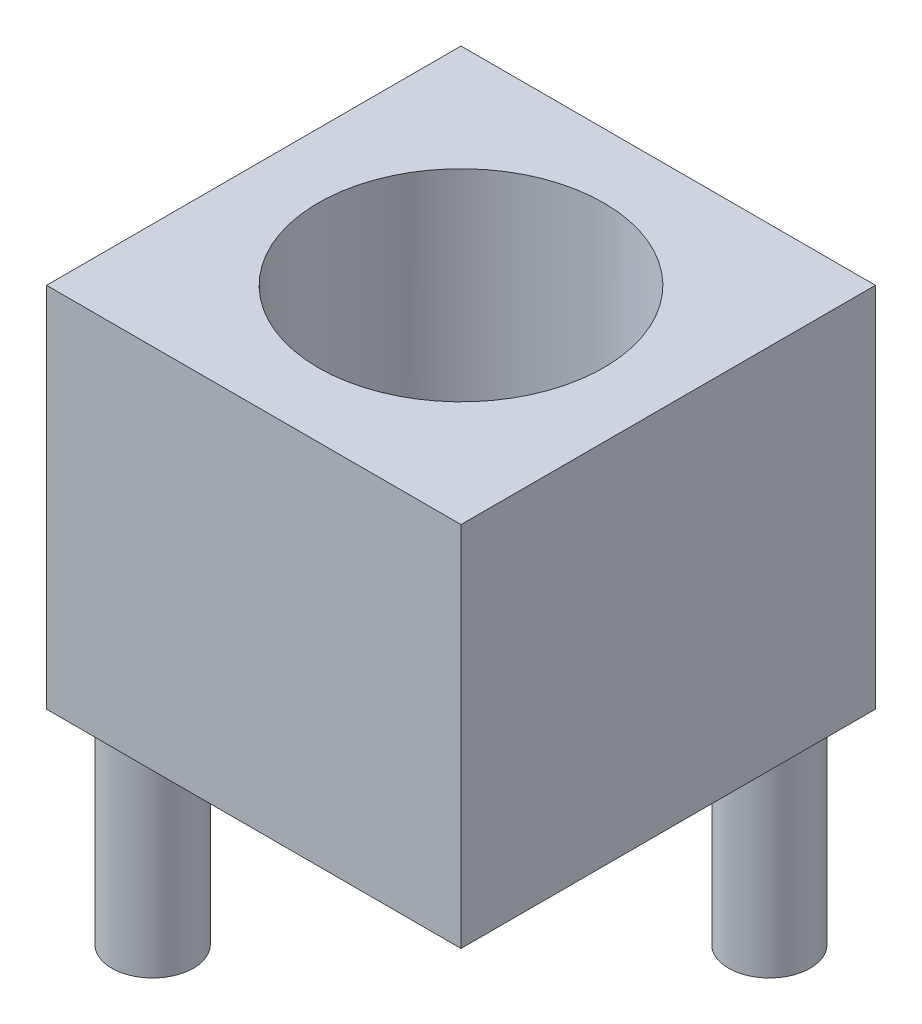
ISO-10303-21;
HEADER;
FILE_DESCRIPTION(('STEP AP214'),'2;1');
FILE_NAME('part.step','',(''),(''),'','','');
FILE_SCHEMA(('AUTOMOTIVE_DESIGN { 1 0 10303 214 1 1 1 1 }'));
ENDSEC;
DATA;
#1=APPLICATION_CONTEXT('core data for automotive mechanical design processes');
#2=APPLICATION_PROTOCOL_DEFINITION('international standard','automotive_design',2000,#1);
#3=PRODUCT_CONTEXT('',#1,'mechanical');
#4=PRODUCT('Part','Part','',(#3));
#5=PRODUCT_RELATED_PRODUCT_CATEGORY('part','',(#4));
#6=PRODUCT_DEFINITION_FORMATION('','',#4);
#7=PRODUCT_DEFINITION_CONTEXT('part definition',#1,'design');
#8=PRODUCT_DEFINITION('design','',#6,#7);
#9=PRODUCT_DEFINITION_SHAPE('','',#8);
#10=(LENGTH_UNIT() NAMED_UNIT(*) SI_UNIT(.MILLI.,.METRE.));
#11=(NAMED_UNIT(*) PLANE_ANGLE_UNIT() SI_UNIT($,.RADIAN.));
#12=(NAMED_UNIT(*) SI_UNIT($,.STERADIAN.) SOLID_ANGLE_UNIT());
#13=UNCERTAINTY_MEASURE_WITH_UNIT(LENGTH_MEASURE(1.E-05),#10,'distance_accuracy_value','');
#14=(GEOMETRIC_REPRESENTATION_CONTEXT(3) GLOBAL_UNCERTAINTY_ASSIGNED_CONTEXT((#13)) GLOBAL_UNIT_ASSIGNED_CONTEXT((#10,
#11,#12)) REPRESENTATION_CONTEXT('',''));
#15=CARTESIAN_POINT('',(0.,0.,0.));
#16=DIRECTION('',(0.,0.,1.));
#17=DIRECTION('',(1.,0.,0.));
#18=AXIS2_PLACEMENT_3D('',#15,#16,#17);
#19=CARTESIAN_POINT('',(0.,2.,0.));
#20=DIRECTION('',(0.,1.,0.));
#21=DIRECTION('',(0.,0.,1.));
#22=AXIS2_PLACEMENT_3D('',#19,#20,#21);
#23=PLANE('',#22);
#24=DIRECTION('',(1.,0.,0.));
#25=VECTOR('',#24,1.);
#26=CARTESIAN_POINT('',(0.,2.,-1.25));
#27=LINE('',#26,#25);
#28=CARTESIAN_POINT('',(-1.22474487139159,2.,-1.25));
#29=VERTEX_POINT('',#28);
#30=CARTESIAN_POINT('',(1.22474487139159,2.,-1.25));
#31=VERTEX_POINT('',#30);
#32=EDGE_CURVE('E157',#29,#31,#27,.T.);
#33=ORIENTED_EDGE('',*,*,#32,.T.);
#34=CARTESIAN_POINT('',(0.,2.,0.));
#35=DIRECTION('',(0.,1.,0.));
#36=DIRECTION('',(0.,0.,1.));
#37=AXIS2_PLACEMENT_3D('',#34,#35,#36);
#38=CIRCLE('',#37,1.75);
#39=EDGE_CURVE('E41',#31,#29,#38,.T.);
#40=ORIENTED_EDGE('',*,*,#39,.T.);
#41=EDGE_LOOP('',(#33,#40));
#42=FACE_BOUND('',#41,.T.);
#43=ADVANCED_FACE('F33',(#42),#23,.T.);
#44=DIRECTION('',(1.,0.,0.));
#45=VECTOR('',#44,1.);
#46=CARTESIAN_POINT('',(0.,2.,1.25));
#47=LINE('',#46,#45);
#48=CARTESIAN_POINT('',(-1.22474487139159,2.,1.25));
#49=VERTEX_POINT('',#48);
#50=CARTESIAN_POINT('',(1.22474487139159,2.,1.25));
#51=VERTEX_POINT('',#50);
#52=EDGE_CURVE('E162',#49,#51,#47,.T.);
#53=ORIENTED_EDGE('',*,*,#52,.F.);
#54=EDGE_CURVE('E149',#49,#51,#38,.T.);
#55=ORIENTED_EDGE('',*,*,#54,.T.);
#56=EDGE_LOOP('',(#53,#55));
#57=FACE_BOUND('',#56,.T.);
#58=ADVANCED_FACE('F208',(#57),#23,.T.);
#59=CARTESIAN_POINT('',(-2.,2.,0.));
#60=DIRECTION('',(1.,0.,0.));
#61=DIRECTION('',(0.,0.,-1.));
#62=AXIS2_PLACEMENT_3D('',#59,#60,#61);
#63=PLANE('',#62);
#64=DIRECTION('',(0.,0.,1.));
#65=VECTOR('',#64,1.);
#66=CARTESIAN_POINT('',(-2.,0.,0.));
#67=LINE('',#66,#65);
#68=CARTESIAN_POINT('',(-2.,0.,-1.25));
#69=VERTEX_POINT('',#68);
#70=CARTESIAN_POINT('',(-2.,0.,1.25));
#71=VERTEX_POINT('',#70);
#72=EDGE_CURVE('E170',#69,#71,#67,.T.);
#73=ORIENTED_EDGE('',*,*,#72,.F.);
#74=DIRECTION('',(0.,-1.,0.));
#75=VECTOR('',#74,1.);
#76=CARTESIAN_POINT('',(-2.,2.,-1.25));
#77=LINE('',#76,#75);
#78=CARTESIAN_POINT('',(-2.,2.,-1.25));
#79=VERTEX_POINT('',#78);
#80=EDGE_CURVE('E186',#79,#69,#77,.T.);
#81=ORIENTED_EDGE('',*,*,#80,.F.);
#82=DIRECTION('',(0.,0.,1.));
#83=VECTOR('',#82,1.);
#84=CARTESIAN_POINT('',(-2.,2.,0.));
#85=LINE('',#84,#83);
#86=CARTESIAN_POINT('',(-2.,2.,1.25));
#87=VERTEX_POINT('',#86);
#88=EDGE_CURVE('E150',#79,#87,#85,.T.);
#89=ORIENTED_EDGE('',*,*,#88,.T.);
#90=DIRECTION('',(0.,-1.,0.));
#91=VECTOR('',#90,1.);
#92=CARTESIAN_POINT('',(-2.,2.,1.25));
#93=LINE('',#92,#91);
#94=EDGE_CURVE('E56',#87,#71,#93,.T.);
#95=ORIENTED_EDGE('',*,*,#94,.T.);
#96=EDGE_LOOP('',(#73,#81,#89,#95));
#97=FACE_BOUND('',#96,.T.);
#98=ADVANCED_FACE('F214',(#97),#63,.T.);
#99=CARTESIAN_POINT('',(0.,2.,-1.25));
#100=DIRECTION('',(0.,0.,-1.));
#101=DIRECTION('',(-1.,0.,0.));
#102=AXIS2_PLACEMENT_3D('',#99,#100,#101);
#103=PLANE('',#102);
#104=DIRECTION('',(1.,0.,0.));
#105=VECTOR('',#104,1.);
#106=CARTESIAN_POINT('',(0.,0.,-1.25));
#107=LINE('',#106,#105);
#108=CARTESIAN_POINT('',(2.,0.,-1.25));
#109=VERTEX_POINT('',#108);
#110=EDGE_CURVE('E172',#69,#109,#107,.T.);
#111=ORIENTED_EDGE('',*,*,#110,.T.);
#112=DIRECTION('',(0.,-1.,0.));
#113=VECTOR('',#112,1.);
#114=CARTESIAN_POINT('',(2.,2.,-1.25));
#115=LINE('',#114,#113);
#116=CARTESIAN_POINT('',(2.,2.,-1.25));
#117=VERTEX_POINT('',#116);
#118=EDGE_CURVE('E183',#117,#109,#115,.T.);
#119=ORIENTED_EDGE('',*,*,#118,.F.);
#120=EDGE_CURVE('E152',#31,#117,#27,.T.);
#121=ORIENTED_EDGE('',*,*,#120,.F.);
#122=ORIENTED_EDGE('',*,*,#32,.F.);
#123=EDGE_CURVE('E154',#79,#29,#27,.T.);
#124=ORIENTED_EDGE('',*,*,#123,.F.);
#125=ORIENTED_EDGE('',*,*,#80,.T.);
#126=EDGE_LOOP('',(#111,#119,#121,#122,#124,#125));
#127=FACE_BOUND('',#126,.T.);
#128=ADVANCED_FACE('F231',(#127),#103,.F.);
#129=CARTESIAN_POINT('',(2.,2.,0.));
#130=DIRECTION('',(1.,0.,0.));
#131=DIRECTION('',(0.,0.,-1.));
#132=AXIS2_PLACEMENT_3D('',#129,#130,#131);
#133=PLANE('',#132);
#134=DIRECTION('',(0.,0.,1.));
#135=VECTOR('',#134,1.);
#136=CARTESIAN_POINT('',(2.,0.,0.));
#137=LINE('',#136,#135);
#138=CARTESIAN_POINT('',(2.,0.,1.25));
#139=VERTEX_POINT('',#138);
#140=EDGE_CURVE('E175',#109,#139,#137,.T.);
#141=ORIENTED_EDGE('',*,*,#140,.T.);
#142=DIRECTION('',(0.,-1.,0.));
#143=VECTOR('',#142,1.);
#144=CARTESIAN_POINT('',(2.,2.,1.25));
#145=LINE('',#144,#143);
#146=CARTESIAN_POINT('',(2.,2.,1.25));
#147=VERTEX_POINT('',#146);
#148=EDGE_CURVE('E181',#147,#139,#145,.T.);
#149=ORIENTED_EDGE('',*,*,#148,.F.);
#150=DIRECTION('',(0.,0.,1.));
#151=VECTOR('',#150,1.);
#152=CARTESIAN_POINT('',(2.,2.,0.));
#153=LINE('',#152,#151);
#154=EDGE_CURVE('E156',#117,#147,#153,.T.);
#155=ORIENTED_EDGE('',*,*,#154,.F.);
#156=ORIENTED_EDGE('',*,*,#118,.T.);
#157=EDGE_LOOP('',(#141,#149,#155,#156));
#158=FACE_BOUND('',#157,.T.);
#159=ADVANCED_FACE('F228',(#158),#133,.F.);
#160=CARTESIAN_POINT('',(2.54,2.,0.));
#161=DIRECTION('',(1.,0.,0.));
#162=DIRECTION('',(0.,0.,-1.));
#163=AXIS2_PLACEMENT_3D('',#160,#161,#162);
#164=PLANE('',#163);
#165=DIRECTION('',(0.,0.,1.));
#166=VECTOR('',#165,1.);
#167=CARTESIAN_POINT('',(2.54,0.,0.));
#168=LINE('',#167,#166);
#169=CARTESIAN_POINT('',(2.54,0.,-2.54));
#170=VERTEX_POINT('',#169);
#171=CARTESIAN_POINT('',(2.54,0.,2.54));
#172=VERTEX_POINT('',#171);
#173=EDGE_CURVE('E146',#170,#172,#168,.T.);
#174=ORIENTED_EDGE('',*,*,#173,.F.);
#175=DIRECTION('',(0.,-1.,0.));
#176=VECTOR('',#175,1.);
#177=CARTESIAN_POINT('',(2.54,2.,-2.54));
#178=LINE('',#177,#176);
#179=CARTESIAN_POINT('',(2.54,4.5,-2.54));
#180=VERTEX_POINT('',#179);
#181=EDGE_CURVE('E128',#180,#170,#178,.T.);
#182=ORIENTED_EDGE('',*,*,#181,.F.);
#183=DIRECTION('',(0.,0.,-1.));
#184=VECTOR('',#183,1.);
#185=CARTESIAN_POINT('',(2.54,4.5,0.));
#186=LINE('',#185,#184);
#187=CARTESIAN_POINT('',(2.54,4.5,2.54));
#188=VERTEX_POINT('',#187);
#189=EDGE_CURVE('E127',#188,#180,#186,.T.);
#190=ORIENTED_EDGE('',*,*,#189,.F.);
#191=DIRECTION('',(0.,-1.,0.));
#192=VECTOR('',#191,1.);
#193=CARTESIAN_POINT('',(2.54,2.,2.54));
#194=LINE('',#193,#192);
#195=EDGE_CURVE('E112',#188,#172,#194,.T.);
#196=ORIENTED_EDGE('',*,*,#195,.T.);
#197=EDGE_LOOP('',(#174,#182,#190,#196));
#198=FACE_BOUND('',#197,.T.);
#199=ADVANCED_FACE('F35',(#198),#164,.T.);
#200=CARTESIAN_POINT('',(0.,2.,-2.54));
#201=DIRECTION('',(0.,0.,-1.));
#202=DIRECTION('',(-1.,0.,0.));
#203=AXIS2_PLACEMENT_3D('',#200,#201,#202);
#204=PLANE('',#203);
#205=DIRECTION('',(1.,0.,0.));
#206=VECTOR('',#205,1.);
#207=CARTESIAN_POINT('',(0.,0.,-2.54));
#208=LINE('',#207,#206);
#209=CARTESIAN_POINT('',(-2.54,0.,-2.54));
#210=VERTEX_POINT('',#209);
#211=EDGE_CURVE('E164',#210,#170,#208,.T.);
#212=ORIENTED_EDGE('',*,*,#211,.F.);
#213=DIRECTION('',(0.,-1.,0.));
#214=VECTOR('',#213,1.);
#215=CARTESIAN_POINT('',(-2.54,2.,-2.54));
#216=LINE('',#215,#214);
#217=CARTESIAN_POINT('',(-2.54,4.5,-2.54));
#218=VERTEX_POINT('',#217);
#219=EDGE_CURVE('E189',#218,#210,#216,.T.);
#220=ORIENTED_EDGE('',*,*,#219,.F.);
#221=DIRECTION('',(-1.,0.,0.));
#222=VECTOR('',#221,1.);
#223=CARTESIAN_POINT('',(0.,4.5,-2.54));
#224=LINE('',#223,#222);
#225=EDGE_CURVE('E132',#180,#218,#224,.T.);
#226=ORIENTED_EDGE('',*,*,#225,.F.);
#227=ORIENTED_EDGE('',*,*,#181,.T.);
#228=EDGE_LOOP('',(#212,#220,#226,#227));
#229=FACE_BOUND('',#228,.T.);
#230=ADVANCED_FACE('F192',(#229),#204,.T.);
#231=CARTESIAN_POINT('',(-2.54,2.,0.));
#232=DIRECTION('',(1.,0.,0.));
#233=DIRECTION('',(0.,0.,-1.));
#234=AXIS2_PLACEMENT_3D('',#231,#232,#233);
#235=PLANE('',#234);
#236=DIRECTION('',(0.,0.,1.));
#237=VECTOR('',#236,1.);
#238=CARTESIAN_POINT('',(-2.54,0.,0.));
#239=LINE('',#238,#237);
#240=CARTESIAN_POINT('',(-2.54,0.,2.54));
#241=VERTEX_POINT('',#240);
#242=EDGE_CURVE('E167',#210,#241,#239,.T.);
#243=ORIENTED_EDGE('',*,*,#242,.T.);
#244=DIRECTION('',(0.,-1.,0.));
#245=VECTOR('',#244,1.);
#246=CARTESIAN_POINT('',(-2.54,2.,2.54));
#247=LINE('',#246,#245);
#248=CARTESIAN_POINT('',(-2.54,4.5,2.54));
#249=VERTEX_POINT('',#248);
#250=EDGE_CURVE('E123',#249,#241,#247,.T.);
#251=ORIENTED_EDGE('',*,*,#250,.F.);
#252=DIRECTION('',(0.,0.,1.));
#253=VECTOR('',#252,1.);
#254=CARTESIAN_POINT('',(-2.54,4.5,0.));
#255=LINE('',#254,#253);
#256=EDGE_CURVE('E137',#218,#249,#255,.T.);
#257=ORIENTED_EDGE('',*,*,#256,.F.);
#258=ORIENTED_EDGE('',*,*,#219,.T.);
#259=EDGE_LOOP('',(#243,#251,#257,#258));
#260=FACE_BOUND('',#259,.T.);
#261=ADVANCED_FACE('F198',(#260),#235,.F.);
#262=CARTESIAN_POINT('',(0.,2.,2.54));
#263=DIRECTION('',(0.,0.,-1.));
#264=DIRECTION('',(-1.,0.,0.));
#265=AXIS2_PLACEMENT_3D('',#262,#263,#264);
#266=PLANE('',#265);
#267=DIRECTION('',(1.,0.,0.));
#268=VECTOR('',#267,1.);
#269=CARTESIAN_POINT('',(0.,0.,2.54));
#270=LINE('',#269,#268);
#271=EDGE_CURVE('E119',#241,#172,#270,.T.);
#272=ORIENTED_EDGE('',*,*,#271,.T.);
#273=ORIENTED_EDGE('',*,*,#195,.F.);
#274=DIRECTION('',(1.,0.,0.));
#275=VECTOR('',#274,1.);
#276=CARTESIAN_POINT('',(0.,4.5,2.54));
#277=LINE('',#276,#275);
#278=EDGE_CURVE('E117',#249,#188,#277,.T.);
#279=ORIENTED_EDGE('',*,*,#278,.F.);
#280=ORIENTED_EDGE('',*,*,#250,.T.);
#281=EDGE_LOOP('',(#272,#273,#279,#280));
#282=FACE_BOUND('',#281,.T.);
#283=ADVANCED_FACE('F114',(#282),#266,.F.);
#284=CARTESIAN_POINT('',(0.,2.,1.25));
#285=DIRECTION('',(0.,0.,-1.));
#286=DIRECTION('',(-1.,0.,0.));
#287=AXIS2_PLACEMENT_3D('',#284,#285,#286);
#288=PLANE('',#287);
#289=DIRECTION('',(1.,0.,0.));
#290=VECTOR('',#289,1.);
#291=CARTESIAN_POINT('',(0.,0.,1.25));
#292=LINE('',#291,#290);
#293=EDGE_CURVE('E153',#71,#139,#292,.T.);
#294=ORIENTED_EDGE('',*,*,#293,.F.);
#295=ORIENTED_EDGE('',*,*,#94,.F.);
#296=EDGE_CURVE('E124',#87,#49,#47,.T.);
#297=ORIENTED_EDGE('',*,*,#296,.T.);
#298=ORIENTED_EDGE('',*,*,#52,.T.);
#299=EDGE_CURVE('E159',#51,#147,#47,.T.);
#300=ORIENTED_EDGE('',*,*,#299,.T.);
#301=ORIENTED_EDGE('',*,*,#148,.T.);
#302=EDGE_LOOP('',(#294,#295,#297,#298,#300,#301));
#303=FACE_BOUND('',#302,.T.);
#304=ADVANCED_FACE('F205',(#303),#288,.T.);
#305=CARTESIAN_POINT('',(0.,0.,0.));
#306=DIRECTION('',(0.,1.,0.));
#307=DIRECTION('',(0.,0.,1.));
#308=AXIS2_PLACEMENT_3D('',#305,#306,#307);
#309=PLANE('',#308);
#310=CARTESIAN_POINT('',(1.89,0.,-1.89));
#311=DIRECTION('',(0.,1.,0.));
#312=DIRECTION('',(0.,0.,1.));
#313=AXIS2_PLACEMENT_3D('',#310,#311,#312);
#314=CIRCLE('',#313,0.499999999999999);
#315=CARTESIAN_POINT('',(1.89,0.,-1.39));
#316=VERTEX_POINT('',#315);
#317=EDGE_CURVE('E11',#316,#316,#314,.F.);
#318=ORIENTED_EDGE('',*,*,#317,.F.);
#319=EDGE_LOOP('',(#318));
#320=FACE_BOUND('',#319,.T.);
#321=CARTESIAN_POINT('',(-1.89,0.,1.89));
#322=DIRECTION('',(0.,1.,0.));
#323=DIRECTION('',(0.,0.,1.));
#324=AXIS2_PLACEMENT_3D('',#321,#322,#323);
#325=CIRCLE('',#324,0.5);
#326=CARTESIAN_POINT('',(-1.89,0.,2.39));
#327=VERTEX_POINT('',#326);
#328=EDGE_CURVE('E289',#327,#327,#325,.T.);
#329=ORIENTED_EDGE('',*,*,#328,.T.);
#330=EDGE_LOOP('',(#329));
#331=FACE_BOUND('',#330,.T.);
#332=ORIENTED_EDGE('',*,*,#173,.T.);
#333=ORIENTED_EDGE('',*,*,#271,.F.);
#334=ORIENTED_EDGE('',*,*,#242,.F.);
#335=ORIENTED_EDGE('',*,*,#211,.T.);
#336=EDGE_LOOP('',(#332,#333,#334,#335));
#337=FACE_BOUND('',#336,.T.);
#338=ORIENTED_EDGE('',*,*,#72,.T.);
#339=ORIENTED_EDGE('',*,*,#293,.T.);
#340=ORIENTED_EDGE('',*,*,#140,.F.);
#341=ORIENTED_EDGE('',*,*,#110,.F.);
#342=EDGE_LOOP('',(#338,#339,#340,#341));
#343=FACE_BOUND('',#342,.T.);
#344=ADVANCED_FACE('F195',(#320,#331,#337,#343),#309,.F.);
#345=CARTESIAN_POINT('',(0.,2.,0.));
#346=DIRECTION('',(0.,1.,0.));
#347=DIRECTION('',(0.,0.,1.));
#348=AXIS2_PLACEMENT_3D('',#345,#346,#347);
#349=PLANE('',#348);
#350=ORIENTED_EDGE('',*,*,#88,.F.);
#351=ORIENTED_EDGE('',*,*,#123,.T.);
#352=EDGE_CURVE('E148',#29,#49,#38,.T.);
#353=ORIENTED_EDGE('',*,*,#352,.T.);
#354=ORIENTED_EDGE('',*,*,#296,.F.);
#355=EDGE_LOOP('',(#350,#351,#353,#354));
#356=FACE_BOUND('',#355,.T.);
#357=ADVANCED_FACE('F223',(#356),#349,.F.);
#358=EDGE_CURVE('E48',#51,#31,#38,.T.);
#359=ORIENTED_EDGE('',*,*,#358,.T.);
#360=ORIENTED_EDGE('',*,*,#120,.T.);
#361=ORIENTED_EDGE('',*,*,#154,.T.);
#362=ORIENTED_EDGE('',*,*,#299,.F.);
#363=EDGE_LOOP('',(#359,#360,#361,#362));
#364=FACE_BOUND('',#363,.T.);
#365=ADVANCED_FACE('F258',(#364),#349,.F.);
#366=CARTESIAN_POINT('',(0.,4.5,0.));
#367=DIRECTION('',(0.,-1.,0.));
#368=DIRECTION('',(0.,0.,-1.));
#369=AXIS2_PLACEMENT_3D('',#366,#367,#368);
#370=CYLINDRICAL_SURFACE('',#369,1.75);
#371=CARTESIAN_POINT('',(0.,4.5,0.));
#372=DIRECTION('',(0.,1.,0.));
#373=DIRECTION('',(0.,0.,1.));
#374=AXIS2_PLACEMENT_3D('',#371,#372,#373);
#375=CIRCLE('',#374,1.75);
#376=CARTESIAN_POINT('',(0.,4.5,1.75));
#377=VERTEX_POINT('',#376);
#378=EDGE_CURVE('E138',#377,#377,#375,.T.);
#379=ORIENTED_EDGE('',*,*,#378,.T.);
#380=EDGE_LOOP('',(#379));
#381=FACE_BOUND('',#380,.T.);
#382=ORIENTED_EDGE('',*,*,#358,.F.);
#383=ORIENTED_EDGE('',*,*,#54,.F.);
#384=ORIENTED_EDGE('',*,*,#352,.F.);
#385=ORIENTED_EDGE('',*,*,#39,.F.);
#386=EDGE_LOOP('',(#382,#383,#384,#385));
#387=FACE_BOUND('',#386,.T.);
#388=ADVANCED_FACE('F219',(#381,#387),#370,.F.);
#389=CARTESIAN_POINT('',(0.,4.5,0.));
#390=DIRECTION('',(0.,1.,0.));
#391=DIRECTION('',(0.,0.,1.));
#392=AXIS2_PLACEMENT_3D('',#389,#390,#391);
#393=PLANE('',#392);
#394=ORIENTED_EDGE('',*,*,#378,.F.);
#395=EDGE_LOOP('',(#394));
#396=FACE_BOUND('',#395,.T.);
#397=ORIENTED_EDGE('',*,*,#278,.T.);
#398=ORIENTED_EDGE('',*,*,#189,.T.);
#399=ORIENTED_EDGE('',*,*,#225,.T.);
#400=ORIENTED_EDGE('',*,*,#256,.T.);
#401=EDGE_LOOP('',(#397,#398,#399,#400));
#402=FACE_BOUND('',#401,.T.);
#403=ADVANCED_FACE('F135',(#396,#402),#393,.T.);
#404=CARTESIAN_POINT('',(-1.89,-2.5,1.89));
#405=DIRECTION('',(0.,1.,0.));
#406=DIRECTION('',(0.,0.,1.));
#407=AXIS2_PLACEMENT_3D('',#404,#405,#406);
#408=CYLINDRICAL_SURFACE('',#407,0.5);
#409=CARTESIAN_POINT('',(-1.89,-2.5,1.89));
#410=DIRECTION('',(0.,1.,0.));
#411=DIRECTION('',(0.,0.,1.));
#412=AXIS2_PLACEMENT_3D('',#409,#410,#411);
#413=CIRCLE('',#412,0.5);
#414=CARTESIAN_POINT('',(-1.89,-2.5,2.39));
#415=VERTEX_POINT('',#414);
#416=EDGE_CURVE('E256',#415,#415,#413,.T.);
#417=ORIENTED_EDGE('',*,*,#416,.T.);
#418=EDGE_LOOP('',(#417));
#419=FACE_BOUND('',#418,.T.);
#420=ORIENTED_EDGE('',*,*,#328,.F.);
#421=EDGE_LOOP('',(#420));
#422=FACE_BOUND('',#421,.T.);
#423=ADVANCED_FACE('F268',(#419,#422),#408,.T.);
#424=CARTESIAN_POINT('',(0.,-2.5,0.));
#425=DIRECTION('',(0.,1.,0.));
#426=DIRECTION('',(0.,0.,1.));
#427=AXIS2_PLACEMENT_3D('',#424,#425,#426);
#428=PLANE('',#427);
#429=ORIENTED_EDGE('',*,*,#416,.F.);
#430=EDGE_LOOP('',(#429));
#431=FACE_BOUND('',#430,.T.);
#432=ADVANCED_FACE('F272',(#431),#428,.F.);
#433=CARTESIAN_POINT('',(1.89,-2.5,-1.89));
#434=DIRECTION('',(0.,1.,0.));
#435=DIRECTION('',(0.,0.,1.));
#436=AXIS2_PLACEMENT_3D('',#433,#434,#435);
#437=CYLINDRICAL_SURFACE('',#436,0.499999999999999);
#438=CARTESIAN_POINT('',(1.89,-2.5,-1.89));
#439=DIRECTION('',(0.,1.,0.));
#440=DIRECTION('',(0.,0.,1.));
#441=AXIS2_PLACEMENT_3D('',#438,#439,#440);
#442=CIRCLE('',#441,0.499999999999999);
#443=CARTESIAN_POINT('',(1.89,-2.5,-1.39));
#444=VERTEX_POINT('',#443);
#445=EDGE_CURVE('E288',#444,#444,#442,.F.);
#446=ORIENTED_EDGE('',*,*,#445,.F.);
#447=EDGE_LOOP('',(#446));
#448=FACE_BOUND('',#447,.T.);
#449=ORIENTED_EDGE('',*,*,#317,.T.);
#450=EDGE_LOOP('',(#449));
#451=FACE_BOUND('',#450,.T.);
#452=ADVANCED_FACE('F276',(#448,#451),#437,.T.);
#453=CARTESIAN_POINT('',(0.,-2.5,0.));
#454=DIRECTION('',(0.,1.,0.));
#455=DIRECTION('',(0.,0.,1.));
#456=AXIS2_PLACEMENT_3D('',#453,#454,#455);
#457=PLANE('',#456);
#458=ORIENTED_EDGE('',*,*,#445,.T.);
#459=EDGE_LOOP('',(#458));
#460=FACE_BOUND('',#459,.T.);
#461=ADVANCED_FACE('F280',(#460),#457,.F.);
#462=CLOSED_SHELL('',(#43,#58,#98,#128,#159,#199,#230,#261,#283,#304,#344,#357,#365,#388,#403,
#423,#432,#452,#461));
#463=MANIFOLD_SOLID_BREP('B2',#462);
#464=ADVANCED_BREP_SHAPE_REPRESENTATION('',(#18,#463),#14);
#465=SHAPE_DEFINITION_REPRESENTATION(#9,#464);
ENDSEC;
END-ISO-10303-21;
